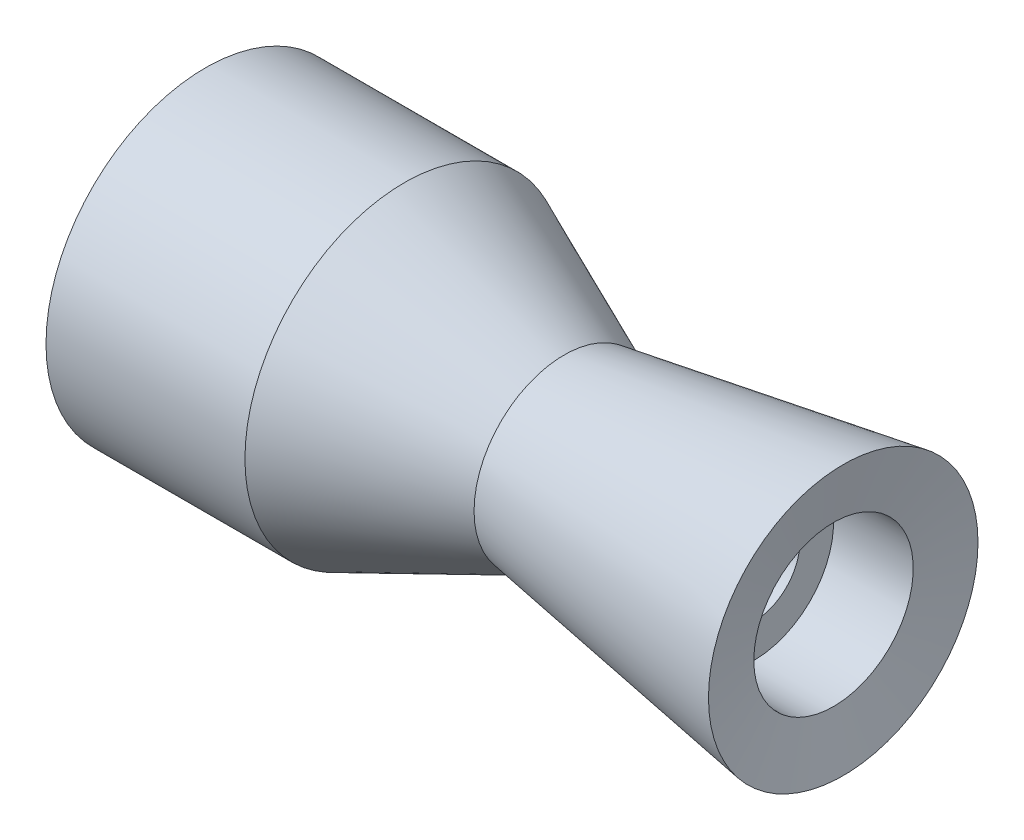
ISO-10303-21;
HEADER;
FILE_DESCRIPTION(('STEP AP214'),'2;1');
FILE_NAME('part.step','',(''),(''),'','','');
FILE_SCHEMA(('AUTOMOTIVE_DESIGN { 1 0 10303 214 1 1 1 1 }'));
ENDSEC;
DATA;
#1=APPLICATION_CONTEXT('core data for automotive mechanical design processes');
#2=APPLICATION_PROTOCOL_DEFINITION('international standard','automotive_design',2000,#1);
#3=PRODUCT_CONTEXT('',#1,'mechanical');
#4=PRODUCT('Part','Part','',(#3));
#5=PRODUCT_RELATED_PRODUCT_CATEGORY('part','',(#4));
#6=PRODUCT_DEFINITION_FORMATION('','',#4);
#7=PRODUCT_DEFINITION_CONTEXT('part definition',#1,'design');
#8=PRODUCT_DEFINITION('design','',#6,#7);
#9=PRODUCT_DEFINITION_SHAPE('','',#8);
#10=(LENGTH_UNIT() NAMED_UNIT(*) SI_UNIT(.MILLI.,.METRE.));
#11=(NAMED_UNIT(*) PLANE_ANGLE_UNIT() SI_UNIT($,.RADIAN.));
#12=(NAMED_UNIT(*) SI_UNIT($,.STERADIAN.) SOLID_ANGLE_UNIT());
#13=UNCERTAINTY_MEASURE_WITH_UNIT(LENGTH_MEASURE(1.E-05),#10,'distance_accuracy_value','');
#14=(GEOMETRIC_REPRESENTATION_CONTEXT(3) GLOBAL_UNCERTAINTY_ASSIGNED_CONTEXT((#13)) GLOBAL_UNIT_ASSIGNED_CONTEXT((#10,
#11,#12)) REPRESENTATION_CONTEXT('',''));
#15=CARTESIAN_POINT('',(0.,0.,0.));
#16=DIRECTION('',(0.,0.,1.));
#17=DIRECTION('',(1.,0.,0.));
#18=AXIS2_PLACEMENT_3D('',#15,#16,#17);
#19=CARTESIAN_POINT('',(0.,0.,0.));
#20=DIRECTION('',(-1.,0.,0.));
#21=DIRECTION('',(0.,0.,1.));
#22=AXIS2_PLACEMENT_3D('',#19,#20,#21);
#23=CYLINDRICAL_SURFACE('',#22,12.6999999999991);
#24=CARTESIAN_POINT('',(96.6194053925777,0.,0.));
#25=DIRECTION('',(-1.,0.,0.));
#26=DIRECTION('',(0.,0.,1.));
#27=AXIS2_PLACEMENT_3D('',#24,#25,#26);
#28=CIRCLE('',#27,12.6999999999991);
#29=CARTESIAN_POINT('',(96.6194053925777,0.,12.6999999999991));
#30=VERTEX_POINT('',#29);
#31=EDGE_CURVE('E55',#30,#30,#28,.T.);
#32=ORIENTED_EDGE('',*,*,#31,.F.);
#33=EDGE_LOOP('',(#32));
#34=FACE_BOUND('',#33,.T.);
#35=CARTESIAN_POINT('',(83.9194053925777,0.,0.));
#36=DIRECTION('',(-1.,0.,0.));
#37=DIRECTION('',(0.,0.,1.));
#38=AXIS2_PLACEMENT_3D('',#35,#36,#37);
#39=CIRCLE('',#38,12.6999999999991);
#40=CARTESIAN_POINT('',(83.9194053925777,0.,12.6999999999991));
#41=VERTEX_POINT('',#40);
#42=EDGE_CURVE('E13',#41,#41,#39,.T.);
#43=ORIENTED_EDGE('',*,*,#42,.T.);
#44=EDGE_LOOP('',(#43));
#45=FACE_BOUND('',#44,.T.);
#46=ADVANCED_FACE('F49',(#34,#45),#23,.F.);
#47=CARTESIAN_POINT('',(96.6194053925777,0.,0.));
#48=DIRECTION('',(1.,0.,0.));
#49=DIRECTION('',(0.,0.,-1.));
#50=AXIS2_PLACEMENT_3D('',#47,#48,#49);
#51=CONICAL_SURFACE('',#50,12.6999999999991,1.39626340127345);
#52=CARTESIAN_POINT('',(98.1654285822372,0.,0.));
#53=DIRECTION('',(-1.,0.,0.));
#54=DIRECTION('',(0.,0.,1.));
#55=AXIS2_PLACEMENT_3D('',#52,#53,#54);
#56=CIRCLE('',#55,21.4679331917127);
#57=CARTESIAN_POINT('',(98.1654285822372,0.,21.4679331917127));
#58=VERTEX_POINT('',#57);
#59=EDGE_CURVE('E68',#58,#58,#56,.T.);
#60=ORIENTED_EDGE('',*,*,#59,.F.);
#61=EDGE_LOOP('',(#60));
#62=FACE_BOUND('',#61,.T.);
#63=ORIENTED_EDGE('',*,*,#31,.T.);
#64=EDGE_LOOP('',(#63));
#65=FACE_BOUND('',#64,.T.);
#66=ADVANCED_FACE('F80',(#62,#65),#51,.F.);
#67=CARTESIAN_POINT('',(83.9194053925777,0.,-7.68858));
#68=DIRECTION('',(-1.,0.,0.));
#69=DIRECTION('',(0.,0.,1.));
#70=AXIS2_PLACEMENT_3D('',#67,#68,#69);
#71=PLANE('',#70);
#72=CARTESIAN_POINT('',(83.9194053925777,0.,0.));
#73=DIRECTION('',(1.,0.,0.));
#74=DIRECTION('',(0.,0.,-1.));
#75=AXIS2_PLACEMENT_3D('',#72,#73,#74);
#76=CIRCLE('',#75,7.34186999999999);
#77=CARTESIAN_POINT('',(83.9194053925777,0.,-7.34186999999999));
#78=VERTEX_POINT('',#77);
#79=EDGE_CURVE('E69',#78,#78,#76,.T.);
#80=ORIENTED_EDGE('',*,*,#79,.F.);
#81=EDGE_LOOP('',(#80));
#82=FACE_BOUND('',#81,.T.);
#83=ORIENTED_EDGE('',*,*,#42,.F.);
#84=EDGE_LOOP('',(#83));
#85=FACE_BOUND('',#84,.T.);
#86=ADVANCED_FACE('F62',(#82,#85),#71,.F.);
#87=CARTESIAN_POINT('',(55.9794053925777,0.,0.));
#88=DIRECTION('',(1.,0.,0.));
#89=DIRECTION('',(0.,0.,-1.));
#90=AXIS2_PLACEMENT_3D('',#87,#88,#89);
#91=CONICAL_SURFACE('',#90,7.34186999999999,1.02974425867665);
#92=CARTESIAN_POINT('',(51.5679648395578,0.,0.));
#93=VERTEX_POINT('',#92);
#94=VERTEX_LOOP('',#93);
#95=FACE_BOUND('',#94,.T.);
#96=CARTESIAN_POINT('',(55.9794053925777,0.,0.));
#97=DIRECTION('',(1.,0.,0.));
#98=DIRECTION('',(0.,0.,-1.));
#99=AXIS2_PLACEMENT_3D('',#96,#97,#98);
#100=CIRCLE('',#99,7.34186999999999);
#101=CARTESIAN_POINT('',(55.9794053925777,0.,-7.34186999999999));
#102=VERTEX_POINT('',#101);
#103=EDGE_CURVE('E66',#102,#102,#100,.T.);
#104=ORIENTED_EDGE('',*,*,#103,.T.);
#105=EDGE_LOOP('',(#104));
#106=FACE_BOUND('',#105,.T.);
#107=ADVANCED_FACE('F58',(#95,#106),#91,.F.);
#108=CARTESIAN_POINT('',(83.9194053925777,0.,0.));
#109=DIRECTION('',(1.,0.,0.));
#110=DIRECTION('',(0.,0.,-1.));
#111=AXIS2_PLACEMENT_3D('',#108,#109,#110);
#112=CYLINDRICAL_SURFACE('',#111,7.34186999999999);
#113=ORIENTED_EDGE('',*,*,#103,.F.);
#114=EDGE_LOOP('',(#113));
#115=FACE_BOUND('',#114,.T.);
#116=ORIENTED_EDGE('',*,*,#79,.T.);
#117=EDGE_LOOP('',(#116));
#118=FACE_BOUND('',#117,.T.);
#119=ADVANCED_FACE('F61',(#115,#118),#112,.F.);
#120=CARTESIAN_POINT('',(98.1654285822372,0.,0.));
#121=DIRECTION('',(1.,0.,0.));
#122=DIRECTION('',(0.,0.,-1.));
#123=AXIS2_PLACEMENT_3D('',#120,#121,#122);
#124=CONICAL_SURFACE('',#123,21.4679331917127,0.15851331842736);
#125=CARTESIAN_POINT('',(53.7154285822372,0.,0.));
#126=DIRECTION('',(-1.,0.,0.));
#127=DIRECTION('',(0.,0.,1.));
#128=AXIS2_PLACEMENT_3D('',#125,#126,#127);
#129=CIRCLE('',#128,14.36240396553);
#130=CARTESIAN_POINT('',(53.7154285822372,0.,14.36240396553));
#131=VERTEX_POINT('',#130);
#132=EDGE_CURVE('E74',#131,#131,#129,.T.);
#133=ORIENTED_EDGE('',*,*,#132,.F.);
#134=EDGE_LOOP('',(#133));
#135=FACE_BOUND('',#134,.T.);
#136=ORIENTED_EDGE('',*,*,#59,.T.);
#137=EDGE_LOOP('',(#136));
#138=FACE_BOUND('',#137,.T.);
#139=ADVANCED_FACE('F98',(#135,#138),#124,.T.);
#140=CARTESIAN_POINT('',(53.7154285822372,0.,0.));
#141=DIRECTION('',(-1.,0.,0.));
#142=DIRECTION('',(0.,0.,1.));
#143=AXIS2_PLACEMENT_3D('',#140,#141,#142);
#144=CONICAL_SURFACE('',#143,14.36240396553,0.409077014892077);
#145=CARTESIAN_POINT('',(28.2558606803158,0.,0.));
#146=DIRECTION('',(-1.,0.,0.));
#147=DIRECTION('',(0.,0.,1.));
#148=AXIS2_PLACEMENT_3D('',#145,#146,#147);
#149=CIRCLE('',#148,25.4);
#150=CARTESIAN_POINT('',(28.2558606803158,0.,25.4));
#151=VERTEX_POINT('',#150);
#152=EDGE_CURVE('E118',#151,#151,#149,.T.);
#153=ORIENTED_EDGE('',*,*,#152,.F.);
#154=EDGE_LOOP('',(#153));
#155=FACE_BOUND('',#154,.T.);
#156=ORIENTED_EDGE('',*,*,#132,.T.);
#157=EDGE_LOOP('',(#156));
#158=FACE_BOUND('',#157,.T.);
#159=ADVANCED_FACE('F101',(#155,#158),#144,.T.);
#160=CARTESIAN_POINT('',(0.,0.,0.));
#161=DIRECTION('',(-1.,0.,0.));
#162=DIRECTION('',(0.,0.,1.));
#163=AXIS2_PLACEMENT_3D('',#160,#161,#162);
#164=CYLINDRICAL_SURFACE('',#163,25.4);
#165=CARTESIAN_POINT('',(-3.43457141776278,0.,0.));
#166=DIRECTION('',(-1.,0.,0.));
#167=DIRECTION('',(0.,0.,1.));
#168=AXIS2_PLACEMENT_3D('',#165,#166,#167);
#169=CIRCLE('',#168,25.4);
#170=CARTESIAN_POINT('',(-3.43457141776278,0.,25.4));
#171=VERTEX_POINT('',#170);
#172=EDGE_CURVE('E117',#171,#171,#169,.T.);
#173=ORIENTED_EDGE('',*,*,#172,.F.);
#174=EDGE_LOOP('',(#173));
#175=FACE_BOUND('',#174,.T.);
#176=ORIENTED_EDGE('',*,*,#152,.T.);
#177=EDGE_LOOP('',(#176));
#178=FACE_BOUND('',#177,.T.);
#179=ADVANCED_FACE('F105',(#175,#178),#164,.T.);
#180=CARTESIAN_POINT('',(-3.43457141776278,25.4,0.));
#181=DIRECTION('',(1.,0.,0.));
#182=DIRECTION('',(0.,0.,-1.));
#183=AXIS2_PLACEMENT_3D('',#180,#181,#182);
#184=PLANE('',#183);
#185=ORIENTED_EDGE('',*,*,#172,.T.);
#186=EDGE_LOOP('',(#185));
#187=FACE_BOUND('',#186,.T.);
#188=ADVANCED_FACE('F109',(#187),#184,.F.);
#189=CLOSED_SHELL('',(#46,#66,#86,#107,#119,#139,#159,#179,#188));
#190=MANIFOLD_SOLID_BREP('B2',#189);
#191=ADVANCED_BREP_SHAPE_REPRESENTATION('',(#18,#190),#14);
#192=SHAPE_DEFINITION_REPRESENTATION(#9,#191);
ENDSEC;
END-ISO-10303-21;
